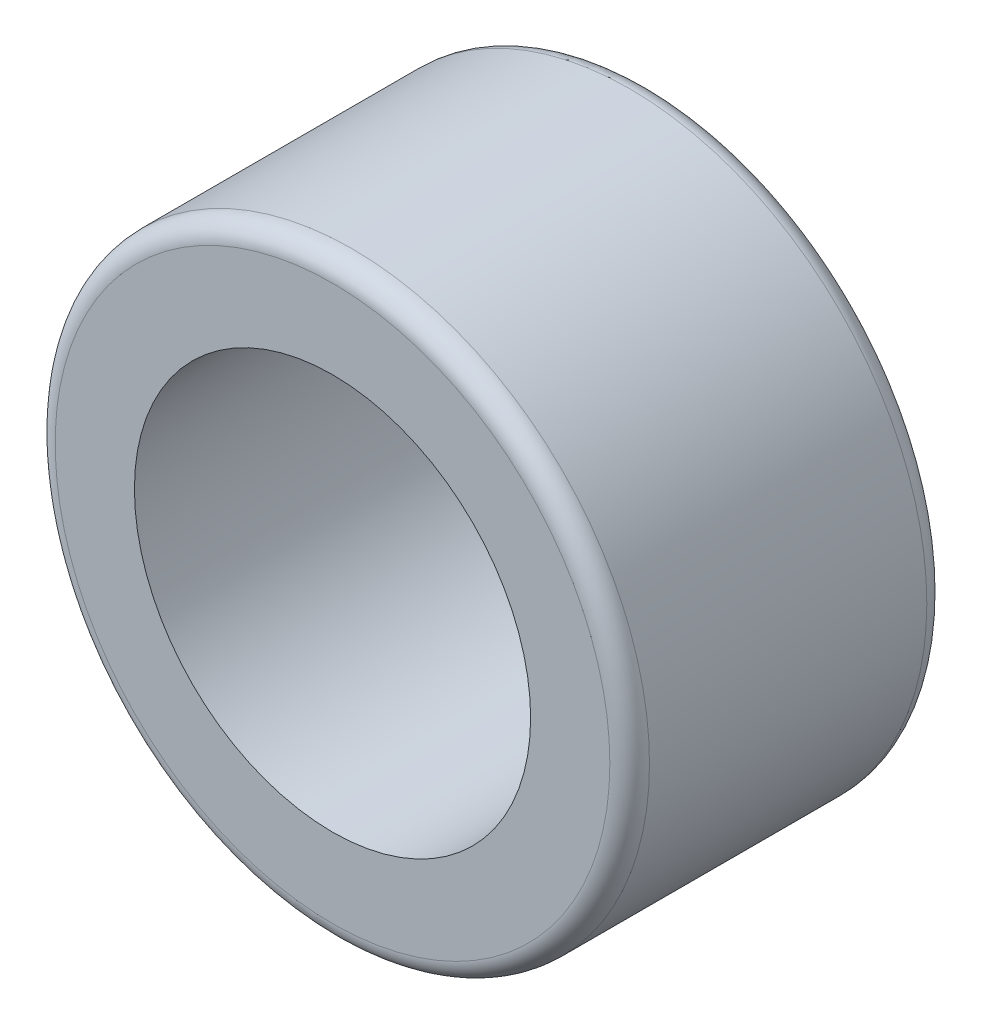
ISO-10303-21;
HEADER;
FILE_DESCRIPTION(('STEP AP214'),'2;1');
FILE_NAME('part.step','',(''),(''),'','','');
FILE_SCHEMA(('AUTOMOTIVE_DESIGN { 1 0 10303 214 1 1 1 1 }'));
ENDSEC;
DATA;
#1=APPLICATION_CONTEXT('core data for automotive mechanical design processes');
#2=APPLICATION_PROTOCOL_DEFINITION('international standard','automotive_design',2000,#1);
#3=PRODUCT_CONTEXT('',#1,'mechanical');
#4=PRODUCT('Part','Part','',(#3));
#5=PRODUCT_RELATED_PRODUCT_CATEGORY('part','',(#4));
#6=PRODUCT_DEFINITION_FORMATION('','',#4);
#7=PRODUCT_DEFINITION_CONTEXT('part definition',#1,'design');
#8=PRODUCT_DEFINITION('design','',#6,#7);
#9=PRODUCT_DEFINITION_SHAPE('','',#8);
#10=(LENGTH_UNIT() NAMED_UNIT(*) SI_UNIT(.MILLI.,.METRE.));
#11=(NAMED_UNIT(*) PLANE_ANGLE_UNIT() SI_UNIT($,.RADIAN.));
#12=(NAMED_UNIT(*) SI_UNIT($,.STERADIAN.) SOLID_ANGLE_UNIT());
#13=UNCERTAINTY_MEASURE_WITH_UNIT(LENGTH_MEASURE(1.E-05),#10,'distance_accuracy_value','');
#14=(GEOMETRIC_REPRESENTATION_CONTEXT(3) GLOBAL_UNCERTAINTY_ASSIGNED_CONTEXT((#13)) GLOBAL_UNIT_ASSIGNED_CONTEXT((#10,
#11,#12)) REPRESENTATION_CONTEXT('',''));
#15=CARTESIAN_POINT('',(0.,0.,0.));
#16=DIRECTION('',(0.,0.,1.));
#17=DIRECTION('',(1.,0.,0.));
#18=AXIS2_PLACEMENT_3D('',#15,#16,#17);
#19=CARTESIAN_POINT('',(0.,0.,8.));
#20=DIRECTION('',(0.,0.,-1.));
#21=DIRECTION('',(-1.,0.,0.));
#22=AXIS2_PLACEMENT_3D('',#19,#20,#21);
#23=CYLINDRICAL_SURFACE('',#22,7.5);
#24=CARTESIAN_POINT('',(0.,0.,7.5));
#25=DIRECTION('',(0.,0.,1.));
#26=DIRECTION('',(1.,0.,0.));
#27=AXIS2_PLACEMENT_3D('',#24,#25,#26);
#28=CIRCLE('',#27,7.5);
#29=CARTESIAN_POINT('',(7.5,0.,7.5));
#30=VERTEX_POINT('',#29);
#31=EDGE_CURVE('E39',#30,#30,#28,.F.);
#32=ORIENTED_EDGE('',*,*,#31,.T.);
#33=EDGE_LOOP('',(#32));
#34=FACE_BOUND('',#33,.T.);
#35=CARTESIAN_POINT('',(0.,0.,0.5));
#36=DIRECTION('',(0.,0.,1.));
#37=DIRECTION('',(1.,0.,0.));
#38=AXIS2_PLACEMENT_3D('',#35,#36,#37);
#39=CIRCLE('',#38,7.5);
#40=CARTESIAN_POINT('',(7.5,0.,0.5));
#41=VERTEX_POINT('',#40);
#42=EDGE_CURVE('E43',#41,#41,#39,.T.);
#43=ORIENTED_EDGE('',*,*,#42,.T.);
#44=EDGE_LOOP('',(#43));
#45=FACE_BOUND('',#44,.T.);
#46=ADVANCED_FACE('F32',(#34,#45),#23,.T.);
#47=CARTESIAN_POINT('',(0.,0.,8.));
#48=DIRECTION('',(0.,0.,1.));
#49=DIRECTION('',(1.,0.,0.));
#50=AXIS2_PLACEMENT_3D('',#47,#48,#49);
#51=PLANE('',#50);
#52=CARTESIAN_POINT('',(0.,0.,8.));
#53=DIRECTION('',(0.,0.,1.));
#54=DIRECTION('',(1.,0.,0.));
#55=AXIS2_PLACEMENT_3D('',#52,#53,#54);
#56=CIRCLE('',#55,7.);
#57=CARTESIAN_POINT('',(7.,0.,8.));
#58=VERTEX_POINT('',#57);
#59=EDGE_CURVE('E47',#58,#58,#56,.T.);
#60=ORIENTED_EDGE('',*,*,#59,.T.);
#61=EDGE_LOOP('',(#60));
#62=FACE_BOUND('',#61,.T.);
#63=CARTESIAN_POINT('',(0.,0.,8.));
#64=DIRECTION('',(0.,0.,1.));
#65=DIRECTION('',(1.,0.,0.));
#66=AXIS2_PLACEMENT_3D('',#63,#64,#65);
#67=CIRCLE('',#66,5.);
#68=CARTESIAN_POINT('',(5.,0.,8.));
#69=VERTEX_POINT('',#68);
#70=EDGE_CURVE('E53',#69,#69,#67,.T.);
#71=ORIENTED_EDGE('',*,*,#70,.F.);
#72=EDGE_LOOP('',(#71));
#73=FACE_BOUND('',#72,.T.);
#74=ADVANCED_FACE('F68',(#62,#73),#51,.T.);
#75=CARTESIAN_POINT('',(0.,0.,0.));
#76=DIRECTION('',(0.,0.,1.));
#77=DIRECTION('',(1.,0.,0.));
#78=AXIS2_PLACEMENT_3D('',#75,#76,#77);
#79=PLANE('',#78);
#80=CARTESIAN_POINT('',(0.,0.,0.));
#81=DIRECTION('',(0.,0.,1.));
#82=DIRECTION('',(1.,0.,0.));
#83=AXIS2_PLACEMENT_3D('',#80,#81,#82);
#84=CIRCLE('',#83,7.);
#85=CARTESIAN_POINT('',(7.,0.,0.));
#86=VERTEX_POINT('',#85);
#87=EDGE_CURVE('E10',#86,#86,#84,.F.);
#88=ORIENTED_EDGE('',*,*,#87,.T.);
#89=EDGE_LOOP('',(#88));
#90=FACE_BOUND('',#89,.T.);
#91=CARTESIAN_POINT('',(0.,0.,0.));
#92=DIRECTION('',(0.,0.,1.));
#93=DIRECTION('',(1.,0.,0.));
#94=AXIS2_PLACEMENT_3D('',#91,#92,#93);
#95=CIRCLE('',#94,5.);
#96=CARTESIAN_POINT('',(5.,0.,0.));
#97=VERTEX_POINT('',#96);
#98=EDGE_CURVE('E52',#97,#97,#95,.T.);
#99=ORIENTED_EDGE('',*,*,#98,.T.);
#100=EDGE_LOOP('',(#99));
#101=FACE_BOUND('',#100,.T.);
#102=ADVANCED_FACE('F59',(#90,#101),#79,.F.);
#103=CARTESIAN_POINT('',(0.,0.,0.));
#104=DIRECTION('',(0.,0.,1.));
#105=DIRECTION('',(1.,0.,0.));
#106=AXIS2_PLACEMENT_3D('',#103,#104,#105);
#107=CYLINDRICAL_SURFACE('',#106,5.);
#108=ORIENTED_EDGE('',*,*,#98,.F.);
#109=EDGE_LOOP('',(#108));
#110=FACE_BOUND('',#109,.T.);
#111=ORIENTED_EDGE('',*,*,#70,.T.);
#112=EDGE_LOOP('',(#111));
#113=FACE_BOUND('',#112,.T.);
#114=ADVANCED_FACE('F61',(#110,#113),#107,.F.);
#115=CARTESIAN_POINT('',(0.,0.,7.5));
#116=DIRECTION('',(0.,0.,1.));
#117=DIRECTION('',(1.,0.,0.));
#118=AXIS2_PLACEMENT_3D('',#115,#116,#117);
#119=TOROIDAL_SURFACE('',#118,7.,0.5);
#120=ORIENTED_EDGE('',*,*,#31,.F.);
#121=EDGE_LOOP('',(#120));
#122=FACE_BOUND('',#121,.T.);
#123=ORIENTED_EDGE('',*,*,#59,.F.);
#124=EDGE_LOOP('',(#123));
#125=FACE_BOUND('',#124,.T.);
#126=ADVANCED_FACE('F64',(#122,#125),#119,.T.);
#127=CARTESIAN_POINT('',(0.,0.,0.5));
#128=DIRECTION('',(0.,0.,1.));
#129=DIRECTION('',(1.,0.,0.));
#130=AXIS2_PLACEMENT_3D('',#127,#128,#129);
#131=TOROIDAL_SURFACE('',#130,7.,0.5);
#132=ORIENTED_EDGE('',*,*,#87,.F.);
#133=EDGE_LOOP('',(#132));
#134=FACE_BOUND('',#133,.T.);
#135=ORIENTED_EDGE('',*,*,#42,.F.);
#136=EDGE_LOOP('',(#135));
#137=FACE_BOUND('',#136,.T.);
#138=ADVANCED_FACE('F34',(#134,#137),#131,.T.);
#139=CLOSED_SHELL('',(#46,#74,#102,#114,#126,#138));
#140=MANIFOLD_SOLID_BREP('B2',#139);
#141=ADVANCED_BREP_SHAPE_REPRESENTATION('',(#18,#140),#14);
#142=SHAPE_DEFINITION_REPRESENTATION(#9,#141);
ENDSEC;
END-ISO-10303-21;
